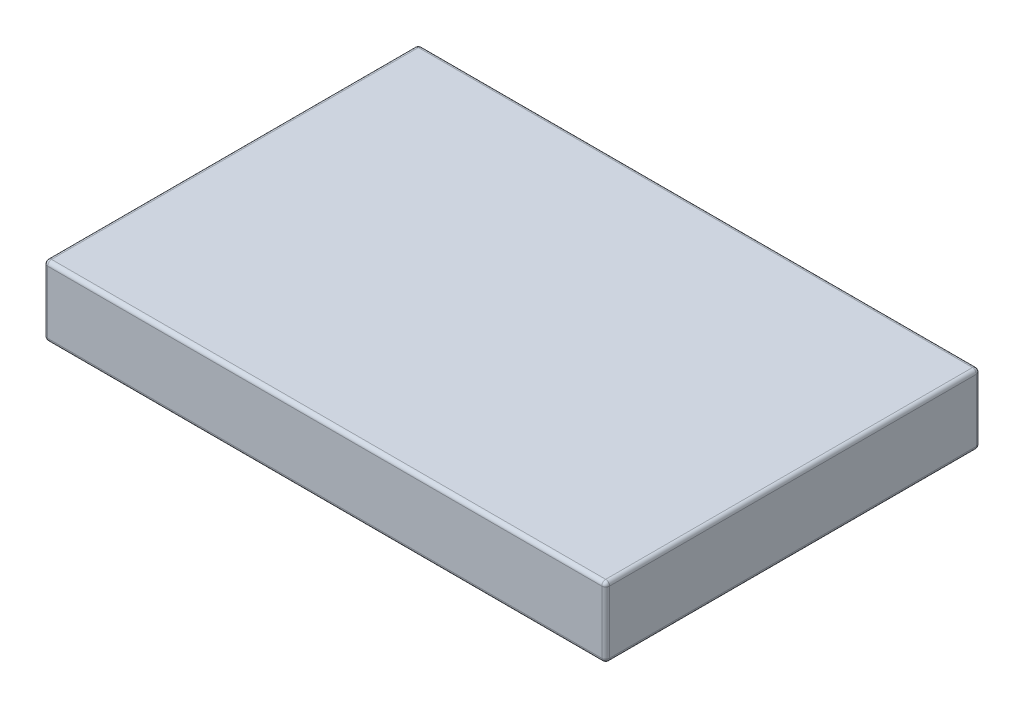
ISO-10303-21;
HEADER;
FILE_DESCRIPTION(('STEP AP214'),'2;1');
FILE_NAME('part.step','',(''),(''),'','','');
FILE_SCHEMA(('AUTOMOTIVE_DESIGN { 1 0 10303 214 1 1 1 1 }'));
ENDSEC;
DATA;
#1=APPLICATION_CONTEXT('core data for automotive mechanical design processes');
#2=APPLICATION_PROTOCOL_DEFINITION('international standard','automotive_design',2000,#1);
#3=PRODUCT_CONTEXT('',#1,'mechanical');
#4=PRODUCT('Part','Part','',(#3));
#5=PRODUCT_RELATED_PRODUCT_CATEGORY('part','',(#4));
#6=PRODUCT_DEFINITION_FORMATION('','',#4);
#7=PRODUCT_DEFINITION_CONTEXT('part definition',#1,'design');
#8=PRODUCT_DEFINITION('design','',#6,#7);
#9=PRODUCT_DEFINITION_SHAPE('','',#8);
#10=(LENGTH_UNIT() NAMED_UNIT(*) SI_UNIT(.MILLI.,.METRE.));
#11=(NAMED_UNIT(*) PLANE_ANGLE_UNIT() SI_UNIT($,.RADIAN.));
#12=(NAMED_UNIT(*) SI_UNIT($,.STERADIAN.) SOLID_ANGLE_UNIT());
#13=UNCERTAINTY_MEASURE_WITH_UNIT(LENGTH_MEASURE(1.E-05),#10,'distance_accuracy_value','');
#14=(GEOMETRIC_REPRESENTATION_CONTEXT(3) GLOBAL_UNCERTAINTY_ASSIGNED_CONTEXT((#13)) GLOBAL_UNIT_ASSIGNED_CONTEXT((#10,
#11,#12)) REPRESENTATION_CONTEXT('',''));
#15=CARTESIAN_POINT('',(0.,0.,0.));
#16=DIRECTION('',(0.,0.,1.));
#17=DIRECTION('',(1.,0.,0.));
#18=AXIS2_PLACEMENT_3D('',#15,#16,#17);
#19=CARTESIAN_POINT('',(1828.8,457.2,1219.2));
#20=DIRECTION('',(-1.,0.,0.));
#21=DIRECTION('',(0.,0.,1.));
#22=AXIS2_PLACEMENT_3D('',#19,#20,#21);
#23=PLANE('',#22);
#24=DIRECTION('',(0.,0.,-1.));
#25=VECTOR('',#24,1.);
#26=CARTESIAN_POINT('',(1828.8,25.4,-1219.2));
#27=LINE('',#26,#25);
#28=CARTESIAN_POINT('',(1828.8,25.4,1193.8));
#29=VERTEX_POINT('',#28);
#30=CARTESIAN_POINT('',(1828.8,25.4,-1193.8));
#31=VERTEX_POINT('',#30);
#32=EDGE_CURVE('E215',#29,#31,#27,.T.);
#33=ORIENTED_EDGE('',*,*,#32,.T.);
#34=DIRECTION('',(0.,-1.,0.));
#35=VECTOR('',#34,1.);
#36=CARTESIAN_POINT('',(1828.8,457.2,-1193.8));
#37=LINE('',#36,#35);
#38=CARTESIAN_POINT('',(1828.8,431.8,-1193.8));
#39=VERTEX_POINT('',#38);
#40=EDGE_CURVE('E213',#31,#39,#37,.F.);
#41=ORIENTED_EDGE('',*,*,#40,.T.);
#42=DIRECTION('',(0.,0.,-1.));
#43=VECTOR('',#42,1.);
#44=CARTESIAN_POINT('',(1828.8,431.8,1219.2));
#45=LINE('',#44,#43);
#46=CARTESIAN_POINT('',(1828.8,431.8,1193.8));
#47=VERTEX_POINT('',#46);
#48=EDGE_CURVE('E206',#39,#47,#45,.F.);
#49=ORIENTED_EDGE('',*,*,#48,.T.);
#50=DIRECTION('',(0.,-1.,0.));
#51=VECTOR('',#50,1.);
#52=CARTESIAN_POINT('',(1828.8,457.2,1193.8));
#53=LINE('',#52,#51);
#54=EDGE_CURVE('E209',#47,#29,#53,.T.);
#55=ORIENTED_EDGE('',*,*,#54,.T.);
#56=EDGE_LOOP('',(#33,#41,#49,#55));
#57=FACE_BOUND('',#56,.T.);
#58=ADVANCED_FACE('F32',(#57),#23,.F.);
#59=CARTESIAN_POINT('',(-1828.8,457.2,-1219.2));
#60=DIRECTION('',(0.,0.,1.));
#61=DIRECTION('',(1.,0.,0.));
#62=AXIS2_PLACEMENT_3D('',#59,#60,#61);
#63=PLANE('',#62);
#64=DIRECTION('',(-1.,0.,0.));
#65=VECTOR('',#64,1.);
#66=CARTESIAN_POINT('',(-1828.8,25.4,-1219.2));
#67=LINE('',#66,#65);
#68=CARTESIAN_POINT('',(1803.4,25.4,-1219.2));
#69=VERTEX_POINT('',#68);
#70=CARTESIAN_POINT('',(-1803.4,25.4,-1219.2));
#71=VERTEX_POINT('',#70);
#72=EDGE_CURVE('E279',#69,#71,#67,.T.);
#73=ORIENTED_EDGE('',*,*,#72,.T.);
#74=DIRECTION('',(0.,-1.,0.));
#75=VECTOR('',#74,1.);
#76=CARTESIAN_POINT('',(-1803.4,457.2,-1219.2));
#77=LINE('',#76,#75);
#78=CARTESIAN_POINT('',(-1803.4,431.8,-1219.2));
#79=VERTEX_POINT('',#78);
#80=EDGE_CURVE('E210',#71,#79,#77,.F.);
#81=ORIENTED_EDGE('',*,*,#80,.T.);
#82=DIRECTION('',(-1.,0.,0.));
#83=VECTOR('',#82,1.);
#84=CARTESIAN_POINT('',(-1828.8,431.8,-1219.2));
#85=LINE('',#84,#83);
#86=CARTESIAN_POINT('',(1803.4,431.8,-1219.2));
#87=VERTEX_POINT('',#86);
#88=EDGE_CURVE('E272',#79,#87,#85,.F.);
#89=ORIENTED_EDGE('',*,*,#88,.T.);
#90=DIRECTION('',(0.,-1.,0.));
#91=VECTOR('',#90,1.);
#92=CARTESIAN_POINT('',(1803.4,457.2,-1219.2));
#93=LINE('',#92,#91);
#94=EDGE_CURVE('E274',#87,#69,#93,.T.);
#95=ORIENTED_EDGE('',*,*,#94,.T.);
#96=EDGE_LOOP('',(#73,#81,#89,#95));
#97=FACE_BOUND('',#96,.T.);
#98=ADVANCED_FACE('F304',(#97),#63,.F.);
#99=CARTESIAN_POINT('',(-1828.8,457.2,1219.2));
#100=DIRECTION('',(1.,0.,0.));
#101=DIRECTION('',(0.,0.,-1.));
#102=AXIS2_PLACEMENT_3D('',#99,#100,#101);
#103=PLANE('',#102);
#104=DIRECTION('',(0.,-1.,0.));
#105=VECTOR('',#104,1.);
#106=CARTESIAN_POINT('',(-1828.8,457.2,-1193.8));
#107=LINE('',#106,#105);
#108=CARTESIAN_POINT('',(-1828.8,431.8,-1193.8));
#109=VERTEX_POINT('',#108);
#110=CARTESIAN_POINT('',(-1828.8,25.4,-1193.8));
#111=VERTEX_POINT('',#110);
#112=EDGE_CURVE('E131',#109,#111,#107,.T.);
#113=ORIENTED_EDGE('',*,*,#112,.T.);
#114=DIRECTION('',(0.,0.,1.));
#115=VECTOR('',#114,1.);
#116=CARTESIAN_POINT('',(-1828.8,25.4,1219.2));
#117=LINE('',#116,#115);
#118=CARTESIAN_POINT('',(-1828.8,25.4,1193.8));
#119=VERTEX_POINT('',#118);
#120=EDGE_CURVE('E127',#111,#119,#117,.T.);
#121=ORIENTED_EDGE('',*,*,#120,.T.);
#122=DIRECTION('',(0.,-1.,0.));
#123=VECTOR('',#122,1.);
#124=CARTESIAN_POINT('',(-1828.8,457.2,1193.8));
#125=LINE('',#124,#123);
#126=CARTESIAN_POINT('',(-1828.8,431.8,1193.8));
#127=VERTEX_POINT('',#126);
#128=EDGE_CURVE('E121',#119,#127,#125,.F.);
#129=ORIENTED_EDGE('',*,*,#128,.T.);
#130=DIRECTION('',(0.,0.,1.));
#131=VECTOR('',#130,1.);
#132=CARTESIAN_POINT('',(-1828.8,431.8,1219.2));
#133=LINE('',#132,#131);
#134=EDGE_CURVE('E124',#127,#109,#133,.F.);
#135=ORIENTED_EDGE('',*,*,#134,.T.);
#136=EDGE_LOOP('',(#113,#121,#129,#135));
#137=FACE_BOUND('',#136,.T.);
#138=ADVANCED_FACE('F123',(#137),#103,.F.);
#139=CARTESIAN_POINT('',(-1828.8,457.2,1219.2));
#140=DIRECTION('',(0.,0.,-1.));
#141=DIRECTION('',(-1.,0.,0.));
#142=AXIS2_PLACEMENT_3D('',#139,#140,#141);
#143=PLANE('',#142);
#144=DIRECTION('',(1.,0.,0.));
#145=VECTOR('',#144,1.);
#146=CARTESIAN_POINT('',(1828.8,25.4,1219.2));
#147=LINE('',#146,#145);
#148=CARTESIAN_POINT('',(-1803.4,25.4,1219.2));
#149=VERTEX_POINT('',#148);
#150=CARTESIAN_POINT('',(1803.4,25.4,1219.2));
#151=VERTEX_POINT('',#150);
#152=EDGE_CURVE('E226',#149,#151,#147,.T.);
#153=ORIENTED_EDGE('',*,*,#152,.T.);
#154=DIRECTION('',(0.,-1.,0.));
#155=VECTOR('',#154,1.);
#156=CARTESIAN_POINT('',(1803.4,457.2,1219.2));
#157=LINE('',#156,#155);
#158=CARTESIAN_POINT('',(1803.4,431.8,1219.2));
#159=VERTEX_POINT('',#158);
#160=EDGE_CURVE('E228',#151,#159,#157,.F.);
#161=ORIENTED_EDGE('',*,*,#160,.T.);
#162=DIRECTION('',(1.,0.,0.));
#163=VECTOR('',#162,1.);
#164=CARTESIAN_POINT('',(-1828.8,431.8,1219.2));
#165=LINE('',#164,#163);
#166=CARTESIAN_POINT('',(-1803.4,431.8,1219.2));
#167=VERTEX_POINT('',#166);
#168=EDGE_CURVE('E219',#159,#167,#165,.F.);
#169=ORIENTED_EDGE('',*,*,#168,.T.);
#170=DIRECTION('',(0.,-1.,0.));
#171=VECTOR('',#170,1.);
#172=CARTESIAN_POINT('',(-1803.4,457.2,1219.2));
#173=LINE('',#172,#171);
#174=EDGE_CURVE('E152',#167,#149,#173,.T.);
#175=ORIENTED_EDGE('',*,*,#174,.T.);
#176=EDGE_LOOP('',(#153,#161,#169,#175));
#177=FACE_BOUND('',#176,.T.);
#178=ADVANCED_FACE('F489',(#177),#143,.F.);
#179=CARTESIAN_POINT('',(0.,457.2,0.));
#180=DIRECTION('',(0.,-1.,0.));
#181=DIRECTION('',(0.,0.,-1.));
#182=AXIS2_PLACEMENT_3D('',#179,#180,#181);
#183=PLANE('',#182);
#184=DIRECTION('',(-1.,0.,0.));
#185=VECTOR('',#184,1.);
#186=CARTESIAN_POINT('',(0.,457.2,-1193.8));
#187=LINE('',#186,#185);
#188=CARTESIAN_POINT('',(1803.4,457.2,-1193.8));
#189=VERTEX_POINT('',#188);
#190=CARTESIAN_POINT('',(-1803.4,457.2,-1193.8));
#191=VERTEX_POINT('',#190);
#192=EDGE_CURVE('E41',#189,#191,#187,.T.);
#193=ORIENTED_EDGE('',*,*,#192,.T.);
#194=DIRECTION('',(0.,0.,1.));
#195=VECTOR('',#194,1.);
#196=CARTESIAN_POINT('',(-1803.4,457.2,0.));
#197=LINE('',#196,#195);
#198=CARTESIAN_POINT('',(-1803.4,457.2,1193.8));
#199=VERTEX_POINT('',#198);
#200=EDGE_CURVE('E11',#191,#199,#197,.T.);
#201=ORIENTED_EDGE('',*,*,#200,.T.);
#202=DIRECTION('',(1.,0.,0.));
#203=VECTOR('',#202,1.);
#204=CARTESIAN_POINT('',(0.,457.2,1193.8));
#205=LINE('',#204,#203);
#206=CARTESIAN_POINT('',(1803.4,457.2,1193.8));
#207=VERTEX_POINT('',#206);
#208=EDGE_CURVE('E231',#199,#207,#205,.T.);
#209=ORIENTED_EDGE('',*,*,#208,.T.);
#210=DIRECTION('',(0.,0.,-1.));
#211=VECTOR('',#210,1.);
#212=CARTESIAN_POINT('',(1803.4,457.2,0.));
#213=LINE('',#212,#211);
#214=EDGE_CURVE('E52',#207,#189,#213,.T.);
#215=ORIENTED_EDGE('',*,*,#214,.T.);
#216=EDGE_LOOP('',(#193,#201,#209,#215));
#217=FACE_BOUND('',#216,.T.);
#218=ADVANCED_FACE('F481',(#217),#183,.F.);
#219=CARTESIAN_POINT('',(0.,0.,0.));
#220=DIRECTION('',(0.,-1.,0.));
#221=DIRECTION('',(0.,0.,-1.));
#222=AXIS2_PLACEMENT_3D('',#219,#220,#221);
#223=PLANE('',#222);
#224=DIRECTION('',(1.,0.,0.));
#225=VECTOR('',#224,1.);
#226=CARTESIAN_POINT('',(-1828.8,0.,1193.8));
#227=LINE('',#226,#225);
#228=CARTESIAN_POINT('',(1803.4,0.,1193.8));
#229=VERTEX_POINT('',#228);
#230=CARTESIAN_POINT('',(-1803.4,0.,1193.8));
#231=VERTEX_POINT('',#230);
#232=EDGE_CURVE('E268',#229,#231,#227,.F.);
#233=ORIENTED_EDGE('',*,*,#232,.T.);
#234=DIRECTION('',(0.,0.,1.));
#235=VECTOR('',#234,1.);
#236=CARTESIAN_POINT('',(-1803.4,0.,-1219.2));
#237=LINE('',#236,#235);
#238=CARTESIAN_POINT('',(-1803.4,0.,-1193.8));
#239=VERTEX_POINT('',#238);
#240=EDGE_CURVE('E262',#231,#239,#237,.F.);
#241=ORIENTED_EDGE('',*,*,#240,.T.);
#242=DIRECTION('',(-1.,0.,0.));
#243=VECTOR('',#242,1.);
#244=CARTESIAN_POINT('',(1828.8,0.,-1193.8));
#245=LINE('',#244,#243);
#246=CARTESIAN_POINT('',(1803.4,0.,-1193.8));
#247=VERTEX_POINT('',#246);
#248=EDGE_CURVE('E256',#239,#247,#245,.F.);
#249=ORIENTED_EDGE('',*,*,#248,.T.);
#250=DIRECTION('',(0.,0.,-1.));
#251=VECTOR('',#250,1.);
#252=CARTESIAN_POINT('',(1803.4,0.,1219.2));
#253=LINE('',#252,#251);
#254=EDGE_CURVE('E263',#247,#229,#253,.F.);
#255=ORIENTED_EDGE('',*,*,#254,.T.);
#256=EDGE_LOOP('',(#233,#241,#249,#255));
#257=FACE_BOUND('',#256,.T.);
#258=ADVANCED_FACE('F266',(#257),#223,.T.);
#259=CARTESIAN_POINT('',(1803.4,431.8,0.));
#260=DIRECTION('',(0.,0.,-1.));
#261=DIRECTION('',(-1.,0.,0.));
#262=AXIS2_PLACEMENT_3D('',#259,#260,#261);
#263=CYLINDRICAL_SURFACE('',#262,25.4);
#264=CARTESIAN_POINT('',(1803.4,431.8,-1193.8));
#265=DIRECTION('',(0.,0.,-1.));
#266=DIRECTION('',(-1.,0.,0.));
#267=AXIS2_PLACEMENT_3D('',#264,#265,#266);
#268=CIRCLE('',#267,25.4);
#269=EDGE_CURVE('E36',#189,#39,#268,.T.);
#270=ORIENTED_EDGE('',*,*,#269,.F.);
#271=ORIENTED_EDGE('',*,*,#214,.F.);
#272=CARTESIAN_POINT('',(1803.4,431.8,1193.8));
#273=DIRECTION('',(0.,0.,1.));
#274=DIRECTION('',(1.,0.,0.));
#275=AXIS2_PLACEMENT_3D('',#272,#273,#274);
#276=CIRCLE('',#275,25.4);
#277=EDGE_CURVE('E192',#47,#207,#276,.T.);
#278=ORIENTED_EDGE('',*,*,#277,.F.);
#279=ORIENTED_EDGE('',*,*,#48,.F.);
#280=EDGE_LOOP('',(#270,#271,#278,#279));
#281=FACE_BOUND('',#280,.T.);
#282=ADVANCED_FACE('F34',(#281),#263,.T.);
#283=CARTESIAN_POINT('',(1803.4,431.8,-1193.8));
#284=DIRECTION('',(0.,0.,1.));
#285=DIRECTION('',(1.,0.,0.));
#286=AXIS2_PLACEMENT_3D('',#283,#284,#285);
#287=SPHERICAL_SURFACE('',#286,25.4);
#288=CARTESIAN_POINT('',(1803.4,431.8,-1193.8));
#289=DIRECTION('',(1.,0.,0.));
#290=DIRECTION('',(0.,1.,0.));
#291=AXIS2_PLACEMENT_3D('',#288,#289,#290);
#292=CIRCLE('',#291,25.4);
#293=EDGE_CURVE('E188',#189,#87,#292,.F.);
#294=ORIENTED_EDGE('',*,*,#293,.F.);
#295=ORIENTED_EDGE('',*,*,#269,.T.);
#296=CARTESIAN_POINT('',(1803.4,431.8,-1193.8));
#297=DIRECTION('',(0.,1.,0.));
#298=DIRECTION('',(0.,0.,1.));
#299=AXIS2_PLACEMENT_3D('',#296,#297,#298);
#300=CIRCLE('',#299,25.4);
#301=EDGE_CURVE('E191',#87,#39,#300,.F.);
#302=ORIENTED_EDGE('',*,*,#301,.F.);
#303=EDGE_LOOP('',(#294,#295,#302));
#304=FACE_BOUND('',#303,.T.);
#305=ADVANCED_FACE('F203',(#304),#287,.T.);
#306=CARTESIAN_POINT('',(1803.4,431.8,1193.8));
#307=DIRECTION('',(0.,0.,1.));
#308=DIRECTION('',(1.,0.,0.));
#309=AXIS2_PLACEMENT_3D('',#306,#307,#308);
#310=SPHERICAL_SURFACE('',#309,25.4);
#311=CARTESIAN_POINT('',(1803.4,431.8,1193.8));
#312=DIRECTION('',(0.,1.,0.));
#313=DIRECTION('',(0.,0.,1.));
#314=AXIS2_PLACEMENT_3D('',#311,#312,#313);
#315=CIRCLE('',#314,25.4);
#316=EDGE_CURVE('E182',#47,#159,#315,.F.);
#317=ORIENTED_EDGE('',*,*,#316,.F.);
#318=ORIENTED_EDGE('',*,*,#277,.T.);
#319=CARTESIAN_POINT('',(1803.4,431.8,1193.8));
#320=DIRECTION('',(1.,0.,0.));
#321=DIRECTION('',(0.,0.,-1.));
#322=AXIS2_PLACEMENT_3D('',#319,#320,#321);
#323=CIRCLE('',#322,25.4);
#324=EDGE_CURVE('E185',#159,#207,#323,.F.);
#325=ORIENTED_EDGE('',*,*,#324,.F.);
#326=EDGE_LOOP('',(#317,#318,#325));
#327=FACE_BOUND('',#326,.T.);
#328=ADVANCED_FACE('F454',(#327),#310,.T.);
#329=CARTESIAN_POINT('',(1803.4,457.2,-1193.8));
#330=DIRECTION('',(0.,-1.,0.));
#331=DIRECTION('',(0.,0.,-1.));
#332=AXIS2_PLACEMENT_3D('',#329,#330,#331);
#333=CYLINDRICAL_SURFACE('',#332,25.4);
#334=ORIENTED_EDGE('',*,*,#301,.T.);
#335=ORIENTED_EDGE('',*,*,#40,.F.);
#336=CARTESIAN_POINT('',(1803.4,25.4,-1193.8));
#337=DIRECTION('',(0.,-1.,0.));
#338=DIRECTION('',(0.,0.,-1.));
#339=AXIS2_PLACEMENT_3D('',#336,#337,#338);
#340=CIRCLE('',#339,25.4);
#341=EDGE_CURVE('E176',#69,#31,#340,.T.);
#342=ORIENTED_EDGE('',*,*,#341,.F.);
#343=ORIENTED_EDGE('',*,*,#94,.F.);
#344=EDGE_LOOP('',(#334,#335,#342,#343));
#345=FACE_BOUND('',#344,.T.);
#346=ADVANCED_FACE('F306',(#345),#333,.T.);
#347=CARTESIAN_POINT('',(0.,431.8,-1193.8));
#348=DIRECTION('',(-1.,0.,0.));
#349=DIRECTION('',(0.,0.,1.));
#350=AXIS2_PLACEMENT_3D('',#347,#348,#349);
#351=CYLINDRICAL_SURFACE('',#350,25.4);
#352=ORIENTED_EDGE('',*,*,#293,.T.);
#353=ORIENTED_EDGE('',*,*,#88,.F.);
#354=CARTESIAN_POINT('',(-1803.4,431.8,-1193.8));
#355=DIRECTION('',(-1.,0.,0.));
#356=DIRECTION('',(0.,0.,1.));
#357=AXIS2_PLACEMENT_3D('',#354,#355,#356);
#358=CIRCLE('',#357,25.4);
#359=EDGE_CURVE('E173',#191,#79,#358,.T.);
#360=ORIENTED_EDGE('',*,*,#359,.F.);
#361=ORIENTED_EDGE('',*,*,#192,.F.);
#362=EDGE_LOOP('',(#352,#353,#360,#361));
#363=FACE_BOUND('',#362,.T.);
#364=ADVANCED_FACE('F438',(#363),#351,.T.);
#365=CARTESIAN_POINT('',(-1803.4,431.8,0.));
#366=DIRECTION('',(0.,0.,1.));
#367=DIRECTION('',(1.,0.,0.));
#368=AXIS2_PLACEMENT_3D('',#365,#366,#367);
#369=CYLINDRICAL_SURFACE('',#368,25.4);
#370=CARTESIAN_POINT('',(-1803.4,431.8,1193.8));
#371=DIRECTION('',(0.,0.,1.));
#372=DIRECTION('',(1.,0.,0.));
#373=AXIS2_PLACEMENT_3D('',#370,#371,#372);
#374=CIRCLE('',#373,25.4);
#375=EDGE_CURVE('E137',#199,#127,#374,.T.);
#376=ORIENTED_EDGE('',*,*,#375,.F.);
#377=ORIENTED_EDGE('',*,*,#200,.F.);
#378=CARTESIAN_POINT('',(-1803.4,431.8,-1193.8));
#379=DIRECTION('',(0.,0.,-1.));
#380=DIRECTION('',(0.,1.,0.));
#381=AXIS2_PLACEMENT_3D('',#378,#379,#380);
#382=CIRCLE('',#381,25.4);
#383=EDGE_CURVE('E140',#109,#191,#382,.T.);
#384=ORIENTED_EDGE('',*,*,#383,.F.);
#385=ORIENTED_EDGE('',*,*,#134,.F.);
#386=EDGE_LOOP('',(#376,#377,#384,#385));
#387=FACE_BOUND('',#386,.T.);
#388=ADVANCED_FACE('F136',(#387),#369,.T.);
#389=CARTESIAN_POINT('',(0.,431.8,1193.8));
#390=DIRECTION('',(1.,0.,0.));
#391=DIRECTION('',(0.,0.,-1.));
#392=AXIS2_PLACEMENT_3D('',#389,#390,#391);
#393=CYLINDRICAL_SURFACE('',#392,25.4);
#394=ORIENTED_EDGE('',*,*,#324,.T.);
#395=ORIENTED_EDGE('',*,*,#208,.F.);
#396=CARTESIAN_POINT('',(-1803.4,431.8,1193.8));
#397=DIRECTION('',(-1.,0.,0.));
#398=DIRECTION('',(0.,0.,1.));
#399=AXIS2_PLACEMENT_3D('',#396,#397,#398);
#400=CIRCLE('',#399,25.4);
#401=EDGE_CURVE('E149',#167,#199,#400,.T.);
#402=ORIENTED_EDGE('',*,*,#401,.F.);
#403=ORIENTED_EDGE('',*,*,#168,.F.);
#404=EDGE_LOOP('',(#394,#395,#402,#403));
#405=FACE_BOUND('',#404,.T.);
#406=ADVANCED_FACE('F422',(#405),#393,.T.);
#407=CARTESIAN_POINT('',(1803.4,457.2,1193.8));
#408=DIRECTION('',(0.,-1.,0.));
#409=DIRECTION('',(0.,0.,-1.));
#410=AXIS2_PLACEMENT_3D('',#407,#408,#409);
#411=CYLINDRICAL_SURFACE('',#410,25.4);
#412=ORIENTED_EDGE('',*,*,#316,.T.);
#413=ORIENTED_EDGE('',*,*,#160,.F.);
#414=CARTESIAN_POINT('',(1803.4,25.4,1193.8));
#415=DIRECTION('',(0.,-1.,0.));
#416=DIRECTION('',(0.,0.,-1.));
#417=AXIS2_PLACEMENT_3D('',#414,#415,#416);
#418=CIRCLE('',#417,25.4);
#419=EDGE_CURVE('E168',#29,#151,#418,.T.);
#420=ORIENTED_EDGE('',*,*,#419,.F.);
#421=ORIENTED_EDGE('',*,*,#54,.F.);
#422=EDGE_LOOP('',(#412,#413,#420,#421));
#423=FACE_BOUND('',#422,.T.);
#424=ADVANCED_FACE('F290',(#423),#411,.T.);
#425=CARTESIAN_POINT('',(1803.4,25.4,1219.2));
#426=DIRECTION('',(0.,0.,1.));
#427=DIRECTION('',(1.,0.,0.));
#428=AXIS2_PLACEMENT_3D('',#425,#426,#427);
#429=CYLINDRICAL_SURFACE('',#428,25.4);
#430=CARTESIAN_POINT('',(1803.4,25.4,-1193.8));
#431=DIRECTION('',(0.,0.,-1.));
#432=DIRECTION('',(-1.,0.,0.));
#433=AXIS2_PLACEMENT_3D('',#430,#431,#432);
#434=CIRCLE('',#433,25.4);
#435=EDGE_CURVE('E179',#31,#247,#434,.T.);
#436=ORIENTED_EDGE('',*,*,#435,.F.);
#437=ORIENTED_EDGE('',*,*,#32,.F.);
#438=CARTESIAN_POINT('',(1803.4,25.4,1193.8));
#439=DIRECTION('',(0.,0.,1.));
#440=DIRECTION('',(1.,0.,0.));
#441=AXIS2_PLACEMENT_3D('',#438,#439,#440);
#442=CIRCLE('',#441,25.4);
#443=EDGE_CURVE('E165',#229,#29,#442,.T.);
#444=ORIENTED_EDGE('',*,*,#443,.F.);
#445=ORIENTED_EDGE('',*,*,#254,.F.);
#446=EDGE_LOOP('',(#436,#437,#444,#445));
#447=FACE_BOUND('',#446,.T.);
#448=ADVANCED_FACE('F287',(#447),#429,.T.);
#449=CARTESIAN_POINT('',(1803.4,25.4,-1193.8));
#450=DIRECTION('',(0.,0.,1.));
#451=DIRECTION('',(1.,0.,0.));
#452=AXIS2_PLACEMENT_3D('',#449,#450,#451);
#453=SPHERICAL_SURFACE('',#452,25.4);
#454=ORIENTED_EDGE('',*,*,#341,.T.);
#455=ORIENTED_EDGE('',*,*,#435,.T.);
#456=CARTESIAN_POINT('',(1803.4,25.4,-1193.8));
#457=DIRECTION('',(1.,0.,0.));
#458=DIRECTION('',(0.,0.,-1.));
#459=AXIS2_PLACEMENT_3D('',#456,#457,#458);
#460=CIRCLE('',#459,25.4);
#461=EDGE_CURVE('E156',#69,#247,#460,.F.);
#462=ORIENTED_EDGE('',*,*,#461,.F.);
#463=EDGE_LOOP('',(#454,#455,#462));
#464=FACE_BOUND('',#463,.T.);
#465=ADVANCED_FACE('F308',(#464),#453,.T.);
#466=CARTESIAN_POINT('',(-1803.4,431.8,-1193.8));
#467=DIRECTION('',(0.,0.,1.));
#468=DIRECTION('',(1.,0.,0.));
#469=AXIS2_PLACEMENT_3D('',#466,#467,#468);
#470=SPHERICAL_SURFACE('',#469,25.4);
#471=ORIENTED_EDGE('',*,*,#383,.T.);
#472=ORIENTED_EDGE('',*,*,#359,.T.);
#473=CARTESIAN_POINT('',(-1803.4,431.8,-1193.8));
#474=DIRECTION('',(0.,1.,0.));
#475=DIRECTION('',(0.,0.,1.));
#476=AXIS2_PLACEMENT_3D('',#473,#474,#475);
#477=CIRCLE('',#476,25.4);
#478=EDGE_CURVE('E153',#109,#79,#477,.F.);
#479=ORIENTED_EDGE('',*,*,#478,.F.);
#480=EDGE_LOOP('',(#471,#472,#479));
#481=FACE_BOUND('',#480,.T.);
#482=ADVANCED_FACE('F310',(#481),#470,.T.);
#483=CARTESIAN_POINT('',(-1803.4,431.8,1193.8));
#484=DIRECTION('',(0.,0.,1.));
#485=DIRECTION('',(1.,0.,0.));
#486=AXIS2_PLACEMENT_3D('',#483,#484,#485);
#487=SPHERICAL_SURFACE('',#486,25.4);
#488=ORIENTED_EDGE('',*,*,#401,.T.);
#489=ORIENTED_EDGE('',*,*,#375,.T.);
#490=CARTESIAN_POINT('',(-1803.4,431.8,1193.8));
#491=DIRECTION('',(0.,1.,0.));
#492=DIRECTION('',(0.,0.,1.));
#493=AXIS2_PLACEMENT_3D('',#490,#491,#492);
#494=CIRCLE('',#493,25.4);
#495=EDGE_CURVE('E146',#167,#127,#494,.F.);
#496=ORIENTED_EDGE('',*,*,#495,.F.);
#497=EDGE_LOOP('',(#488,#489,#496));
#498=FACE_BOUND('',#497,.T.);
#499=ADVANCED_FACE('F145',(#498),#487,.T.);
#500=CARTESIAN_POINT('',(1803.4,25.4,1193.8));
#501=DIRECTION('',(0.,0.,1.));
#502=DIRECTION('',(1.,0.,0.));
#503=AXIS2_PLACEMENT_3D('',#500,#501,#502);
#504=SPHERICAL_SURFACE('',#503,25.4);
#505=ORIENTED_EDGE('',*,*,#443,.T.);
#506=ORIENTED_EDGE('',*,*,#419,.T.);
#507=CARTESIAN_POINT('',(1803.4,25.4,1193.8));
#508=DIRECTION('',(1.,0.,0.));
#509=DIRECTION('',(0.,0.,-1.));
#510=AXIS2_PLACEMENT_3D('',#507,#508,#509);
#511=CIRCLE('',#510,25.4);
#512=EDGE_CURVE('E154',#229,#151,#511,.F.);
#513=ORIENTED_EDGE('',*,*,#512,.F.);
#514=EDGE_LOOP('',(#505,#506,#513));
#515=FACE_BOUND('',#514,.T.);
#516=ADVANCED_FACE('F292',(#515),#504,.T.);
#517=CARTESIAN_POINT('',(-1828.8,25.4,-1193.8));
#518=DIRECTION('',(1.,0.,0.));
#519=DIRECTION('',(0.,0.,-1.));
#520=AXIS2_PLACEMENT_3D('',#517,#518,#519);
#521=CYLINDRICAL_SURFACE('',#520,25.4);
#522=ORIENTED_EDGE('',*,*,#461,.T.);
#523=ORIENTED_EDGE('',*,*,#248,.F.);
#524=CARTESIAN_POINT('',(-1803.4,25.4,-1193.8));
#525=DIRECTION('',(-1.,0.,0.));
#526=DIRECTION('',(0.,0.,1.));
#527=AXIS2_PLACEMENT_3D('',#524,#525,#526);
#528=CIRCLE('',#527,25.4);
#529=EDGE_CURVE('E159',#71,#239,#528,.T.);
#530=ORIENTED_EDGE('',*,*,#529,.F.);
#531=ORIENTED_EDGE('',*,*,#72,.F.);
#532=EDGE_LOOP('',(#522,#523,#530,#531));
#533=FACE_BOUND('',#532,.T.);
#534=ADVANCED_FACE('F258',(#533),#521,.T.);
#535=CARTESIAN_POINT('',(-1803.4,457.2,-1193.8));
#536=DIRECTION('',(0.,-1.,0.));
#537=DIRECTION('',(0.,0.,-1.));
#538=AXIS2_PLACEMENT_3D('',#535,#536,#537);
#539=CYLINDRICAL_SURFACE('',#538,25.4);
#540=ORIENTED_EDGE('',*,*,#478,.T.);
#541=ORIENTED_EDGE('',*,*,#80,.F.);
#542=CARTESIAN_POINT('',(-1803.4,25.4,-1193.8));
#543=DIRECTION('',(0.,-1.,0.));
#544=DIRECTION('',(0.,0.,-1.));
#545=AXIS2_PLACEMENT_3D('',#542,#543,#544);
#546=CIRCLE('',#545,25.4);
#547=EDGE_CURVE('E245',#111,#71,#546,.T.);
#548=ORIENTED_EDGE('',*,*,#547,.F.);
#549=ORIENTED_EDGE('',*,*,#112,.F.);
#550=EDGE_LOOP('',(#540,#541,#548,#549));
#551=FACE_BOUND('',#550,.T.);
#552=ADVANCED_FACE('F302',(#551),#539,.T.);
#553=CARTESIAN_POINT('',(-1803.4,457.2,1193.8));
#554=DIRECTION('',(0.,-1.,0.));
#555=DIRECTION('',(0.,0.,-1.));
#556=AXIS2_PLACEMENT_3D('',#553,#554,#555);
#557=CYLINDRICAL_SURFACE('',#556,25.4);
#558=ORIENTED_EDGE('',*,*,#495,.T.);
#559=ORIENTED_EDGE('',*,*,#128,.F.);
#560=CARTESIAN_POINT('',(-1803.4,25.4,1193.8));
#561=DIRECTION('',(0.,-1.,0.));
#562=DIRECTION('',(0.,0.,-1.));
#563=AXIS2_PLACEMENT_3D('',#560,#561,#562);
#564=CIRCLE('',#563,25.4);
#565=EDGE_CURVE('E242',#149,#119,#564,.T.);
#566=ORIENTED_EDGE('',*,*,#565,.F.);
#567=ORIENTED_EDGE('',*,*,#174,.F.);
#568=EDGE_LOOP('',(#558,#559,#566,#567));
#569=FACE_BOUND('',#568,.T.);
#570=ADVANCED_FACE('F151',(#569),#557,.T.);
#571=CARTESIAN_POINT('',(-1828.8,25.4,1193.8));
#572=DIRECTION('',(-1.,0.,0.));
#573=DIRECTION('',(0.,0.,1.));
#574=AXIS2_PLACEMENT_3D('',#571,#572,#573);
#575=CYLINDRICAL_SURFACE('',#574,25.4);
#576=ORIENTED_EDGE('',*,*,#512,.T.);
#577=ORIENTED_EDGE('',*,*,#152,.F.);
#578=CARTESIAN_POINT('',(-1803.4,25.4,1193.8));
#579=DIRECTION('',(-1.,0.,0.));
#580=DIRECTION('',(0.,0.,1.));
#581=AXIS2_PLACEMENT_3D('',#578,#579,#580);
#582=CIRCLE('',#581,25.4);
#583=EDGE_CURVE('E239',#231,#149,#582,.T.);
#584=ORIENTED_EDGE('',*,*,#583,.F.);
#585=ORIENTED_EDGE('',*,*,#232,.F.);
#586=EDGE_LOOP('',(#576,#577,#584,#585));
#587=FACE_BOUND('',#586,.T.);
#588=ADVANCED_FACE('F295',(#587),#575,.T.);
#589=CARTESIAN_POINT('',(-1803.4,25.4,-1193.8));
#590=DIRECTION('',(0.,0.,1.));
#591=DIRECTION('',(1.,0.,0.));
#592=AXIS2_PLACEMENT_3D('',#589,#590,#591);
#593=SPHERICAL_SURFACE('',#592,25.4);
#594=ORIENTED_EDGE('',*,*,#547,.T.);
#595=ORIENTED_EDGE('',*,*,#529,.T.);
#596=CARTESIAN_POINT('',(-1803.4,25.4,-1193.8));
#597=DIRECTION('',(0.,0.,-1.));
#598=DIRECTION('',(-1.,0.,0.));
#599=AXIS2_PLACEMENT_3D('',#596,#597,#598);
#600=CIRCLE('',#599,25.4);
#601=EDGE_CURVE('E237',#111,#239,#600,.F.);
#602=ORIENTED_EDGE('',*,*,#601,.F.);
#603=EDGE_LOOP('',(#594,#595,#602));
#604=FACE_BOUND('',#603,.T.);
#605=ADVANCED_FACE('F252',(#604),#593,.T.);
#606=CARTESIAN_POINT('',(-1803.4,25.4,1193.8));
#607=DIRECTION('',(0.,0.,1.));
#608=DIRECTION('',(1.,0.,0.));
#609=AXIS2_PLACEMENT_3D('',#606,#607,#608);
#610=SPHERICAL_SURFACE('',#609,25.4);
#611=ORIENTED_EDGE('',*,*,#583,.T.);
#612=ORIENTED_EDGE('',*,*,#565,.T.);
#613=CARTESIAN_POINT('',(-1803.4,25.4,1193.8));
#614=DIRECTION('',(0.,0.,1.));
#615=DIRECTION('',(1.,0.,0.));
#616=AXIS2_PLACEMENT_3D('',#613,#614,#615);
#617=CIRCLE('',#616,25.4);
#618=EDGE_CURVE('E235',#231,#119,#617,.F.);
#619=ORIENTED_EDGE('',*,*,#618,.F.);
#620=EDGE_LOOP('',(#611,#612,#619));
#621=FACE_BOUND('',#620,.T.);
#622=ADVANCED_FACE('F330',(#621),#610,.T.);
#623=CARTESIAN_POINT('',(-1803.4,25.4,1219.2));
#624=DIRECTION('',(0.,0.,-1.));
#625=DIRECTION('',(-1.,0.,0.));
#626=AXIS2_PLACEMENT_3D('',#623,#624,#625);
#627=CYLINDRICAL_SURFACE('',#626,25.4);
#628=ORIENTED_EDGE('',*,*,#601,.T.);
#629=ORIENTED_EDGE('',*,*,#240,.F.);
#630=ORIENTED_EDGE('',*,*,#618,.T.);
#631=ORIENTED_EDGE('',*,*,#120,.F.);
#632=EDGE_LOOP('',(#628,#629,#630,#631));
#633=FACE_BOUND('',#632,.T.);
#634=ADVANCED_FACE('F327',(#633),#627,.T.);
#635=CLOSED_SHELL('',(#58,#98,#138,#178,#218,#258,#282,#305,#328,#346,#364,#388,#406,#424,#448,
#465,#482,#499,#516,#534,#552,#570,#588,#605,#622,#634));
#636=MANIFOLD_SOLID_BREP('B2',#635);
#637=ADVANCED_BREP_SHAPE_REPRESENTATION('',(#18,#636),#14);
#638=SHAPE_DEFINITION_REPRESENTATION(#9,#637);
ENDSEC;
END-ISO-10303-21;
